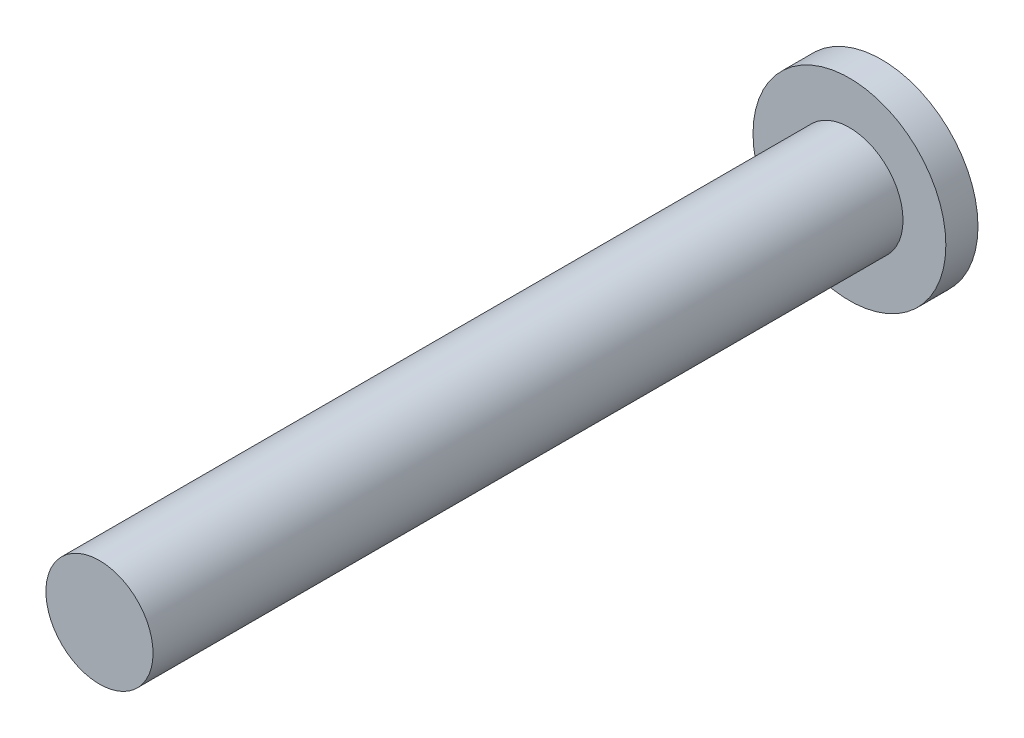
ISO-10303-21;
HEADER;
FILE_DESCRIPTION(('STEP AP214'),'2;1');
FILE_NAME('part.step','',(''),(''),'','','');
FILE_SCHEMA(('AUTOMOTIVE_DESIGN { 1 0 10303 214 1 1 1 1 }'));
ENDSEC;
DATA;
#1=APPLICATION_CONTEXT('core data for automotive mechanical design processes');
#2=APPLICATION_PROTOCOL_DEFINITION('international standard','automotive_design',2000,#1);
#3=PRODUCT_CONTEXT('',#1,'mechanical');
#4=PRODUCT('Part','Part','',(#3));
#5=PRODUCT_RELATED_PRODUCT_CATEGORY('part','',(#4));
#6=PRODUCT_DEFINITION_FORMATION('','',#4);
#7=PRODUCT_DEFINITION_CONTEXT('part definition',#1,'design');
#8=PRODUCT_DEFINITION('design','',#6,#7);
#9=PRODUCT_DEFINITION_SHAPE('','',#8);
#10=(LENGTH_UNIT() NAMED_UNIT(*) SI_UNIT(.MILLI.,.METRE.));
#11=(NAMED_UNIT(*) PLANE_ANGLE_UNIT() SI_UNIT($,.RADIAN.));
#12=(NAMED_UNIT(*) SI_UNIT($,.STERADIAN.) SOLID_ANGLE_UNIT());
#13=UNCERTAINTY_MEASURE_WITH_UNIT(LENGTH_MEASURE(1.E-05),#10,'distance_accuracy_value','');
#14=(GEOMETRIC_REPRESENTATION_CONTEXT(3) GLOBAL_UNCERTAINTY_ASSIGNED_CONTEXT((#13)) GLOBAL_UNIT_ASSIGNED_CONTEXT((#10,
#11,#12)) REPRESENTATION_CONTEXT('',''));
#15=CARTESIAN_POINT('',(0.,0.,0.));
#16=DIRECTION('',(0.,0.,1.));
#17=DIRECTION('',(1.,0.,0.));
#18=AXIS2_PLACEMENT_3D('',#15,#16,#17);
#19=CARTESIAN_POINT('',(0.,0.,0.));
#20=DIRECTION('',(0.,0.,1.));
#21=DIRECTION('',(1.,0.,0.));
#22=AXIS2_PLACEMENT_3D('',#19,#20,#21);
#23=PLANE('',#22);
#24=CARTESIAN_POINT('',(0.,0.,0.));
#25=DIRECTION('',(0.,0.,1.));
#26=DIRECTION('',(1.,0.,0.));
#27=AXIS2_PLACEMENT_3D('',#24,#25,#26);
#28=CIRCLE('',#27,4.5);
#29=CARTESIAN_POINT('',(4.5,0.,0.));
#30=VERTEX_POINT('',#29);
#31=EDGE_CURVE('E36',#30,#30,#28,.T.);
#32=ORIENTED_EDGE('',*,*,#31,.T.);
#33=EDGE_LOOP('',(#32));
#34=FACE_BOUND('',#33,.T.);
#35=CARTESIAN_POINT('',(0.,0.,0.));
#36=DIRECTION('',(0.,0.,1.));
#37=DIRECTION('',(1.,0.,0.));
#38=AXIS2_PLACEMENT_3D('',#35,#36,#37);
#39=CIRCLE('',#38,2.5);
#40=CARTESIAN_POINT('',(2.5,0.,0.));
#41=VERTEX_POINT('',#40);
#42=EDGE_CURVE('E45',#41,#41,#39,.T.);
#43=ORIENTED_EDGE('',*,*,#42,.F.);
#44=EDGE_LOOP('',(#43));
#45=FACE_BOUND('',#44,.T.);
#46=ADVANCED_FACE('F32',(#34,#45),#23,.T.);
#47=CARTESIAN_POINT('',(0.,0.,-1.5));
#48=DIRECTION('',(0.,0.,1.));
#49=DIRECTION('',(1.,0.,0.));
#50=AXIS2_PLACEMENT_3D('',#47,#48,#49);
#51=CYLINDRICAL_SURFACE('',#50,4.5);
#52=CARTESIAN_POINT('',(0.,0.,-1.5));
#53=DIRECTION('',(0.,0.,1.));
#54=DIRECTION('',(1.,0.,0.));
#55=AXIS2_PLACEMENT_3D('',#52,#53,#54);
#56=CIRCLE('',#55,4.5);
#57=CARTESIAN_POINT('',(4.5,0.,-1.5));
#58=VERTEX_POINT('',#57);
#59=EDGE_CURVE('E10',#58,#58,#56,.T.);
#60=ORIENTED_EDGE('',*,*,#59,.T.);
#61=EDGE_LOOP('',(#60));
#62=FACE_BOUND('',#61,.T.);
#63=ORIENTED_EDGE('',*,*,#31,.F.);
#64=EDGE_LOOP('',(#63));
#65=FACE_BOUND('',#64,.T.);
#66=ADVANCED_FACE('F34',(#62,#65),#51,.T.);
#67=CARTESIAN_POINT('',(0.,0.,-1.5));
#68=DIRECTION('',(0.,0.,1.));
#69=DIRECTION('',(1.,0.,0.));
#70=AXIS2_PLACEMENT_3D('',#67,#68,#69);
#71=PLANE('',#70);
#72=ORIENTED_EDGE('',*,*,#59,.F.);
#73=EDGE_LOOP('',(#72));
#74=FACE_BOUND('',#73,.T.);
#75=ADVANCED_FACE('F56',(#74),#71,.F.);
#76=CARTESIAN_POINT('',(0.,0.,35.));
#77=DIRECTION('',(0.,0.,-1.));
#78=DIRECTION('',(-1.,0.,0.));
#79=AXIS2_PLACEMENT_3D('',#76,#77,#78);
#80=CYLINDRICAL_SURFACE('',#79,2.5);
#81=CARTESIAN_POINT('',(0.,0.,35.));
#82=DIRECTION('',(0.,0.,1.));
#83=DIRECTION('',(1.,0.,0.));
#84=AXIS2_PLACEMENT_3D('',#81,#82,#83);
#85=CIRCLE('',#84,2.5);
#86=CARTESIAN_POINT('',(2.5,0.,35.));
#87=VERTEX_POINT('',#86);
#88=EDGE_CURVE('E43',#87,#87,#85,.T.);
#89=ORIENTED_EDGE('',*,*,#88,.F.);
#90=EDGE_LOOP('',(#89));
#91=FACE_BOUND('',#90,.T.);
#92=ORIENTED_EDGE('',*,*,#42,.T.);
#93=EDGE_LOOP('',(#92));
#94=FACE_BOUND('',#93,.T.);
#95=ADVANCED_FACE('F53',(#91,#94),#80,.T.);
#96=CARTESIAN_POINT('',(0.,0.,35.));
#97=DIRECTION('',(0.,0.,1.));
#98=DIRECTION('',(1.,0.,0.));
#99=AXIS2_PLACEMENT_3D('',#96,#97,#98);
#100=PLANE('',#99);
#101=ORIENTED_EDGE('',*,*,#88,.T.);
#102=EDGE_LOOP('',(#101));
#103=FACE_BOUND('',#102,.T.);
#104=ADVANCED_FACE('F51',(#103),#100,.T.);
#105=CLOSED_SHELL('',(#46,#66,#75,#95,#104));
#106=MANIFOLD_SOLID_BREP('B2',#105);
#107=ADVANCED_BREP_SHAPE_REPRESENTATION('',(#18,#106),#14);
#108=SHAPE_DEFINITION_REPRESENTATION(#9,#107);
ENDSEC;
END-ISO-10303-21;
